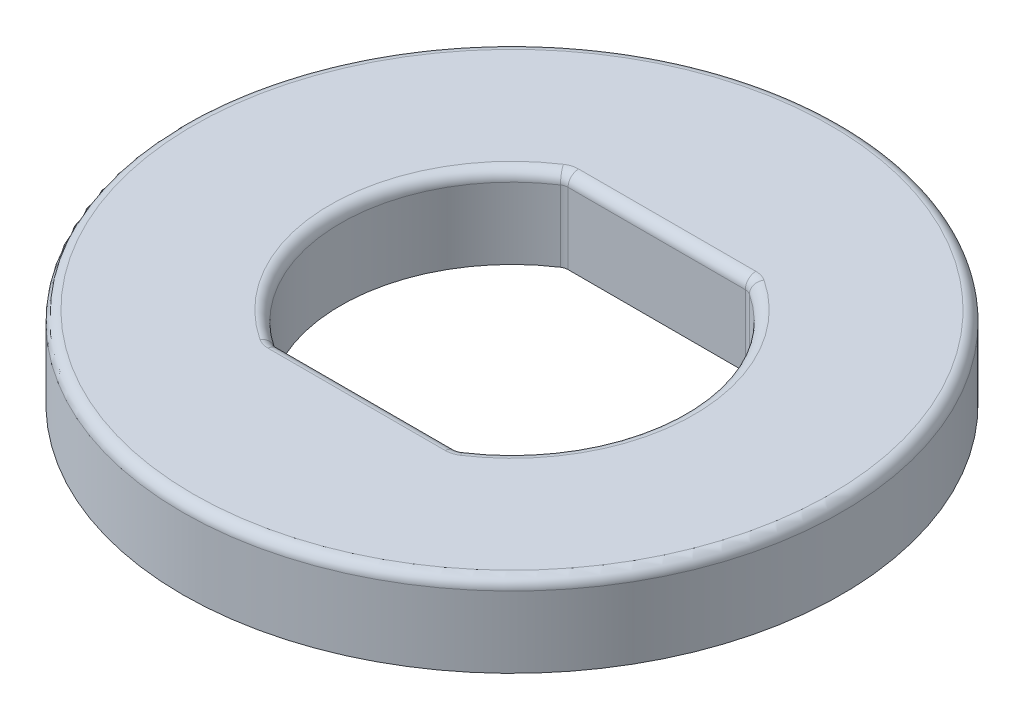
ISO-10303-21;
HEADER;
FILE_DESCRIPTION(('STEP AP214'),'2;1');
FILE_NAME('part.step','',(''),(''),'','','');
FILE_SCHEMA(('AUTOMOTIVE_DESIGN { 1 0 10303 214 1 1 1 1 }'));
ENDSEC;
DATA;
#1=APPLICATION_CONTEXT('core data for automotive mechanical design processes');
#2=APPLICATION_PROTOCOL_DEFINITION('international standard','automotive_design',2000,#1);
#3=PRODUCT_CONTEXT('',#1,'mechanical');
#4=PRODUCT('Part','Part','',(#3));
#5=PRODUCT_RELATED_PRODUCT_CATEGORY('part','',(#4));
#6=PRODUCT_DEFINITION_FORMATION('','',#4);
#7=PRODUCT_DEFINITION_CONTEXT('part definition',#1,'design');
#8=PRODUCT_DEFINITION('design','',#6,#7);
#9=PRODUCT_DEFINITION_SHAPE('','',#8);
#10=(LENGTH_UNIT() NAMED_UNIT(*) SI_UNIT(.MILLI.,.METRE.));
#11=(NAMED_UNIT(*) PLANE_ANGLE_UNIT() SI_UNIT($,.RADIAN.));
#12=(NAMED_UNIT(*) SI_UNIT($,.STERADIAN.) SOLID_ANGLE_UNIT());
#13=UNCERTAINTY_MEASURE_WITH_UNIT(LENGTH_MEASURE(1.E-05),#10,'distance_accuracy_value','');
#14=(GEOMETRIC_REPRESENTATION_CONTEXT(3) GLOBAL_UNCERTAINTY_ASSIGNED_CONTEXT((#13)) GLOBAL_UNIT_ASSIGNED_CONTEXT((#10,
#11,#12)) REPRESENTATION_CONTEXT('',''));
#15=CARTESIAN_POINT('',(0.,0.,0.));
#16=DIRECTION('',(0.,0.,1.));
#17=DIRECTION('',(1.,0.,0.));
#18=AXIS2_PLACEMENT_3D('',#15,#16,#17);
#19=CARTESIAN_POINT('',(0.,1.4732,0.));
#20=DIRECTION('',(0.,-1.,0.));
#21=DIRECTION('',(0.,0.,-1.));
#22=AXIS2_PLACEMENT_3D('',#19,#20,#21);
#23=CYLINDRICAL_SURFACE('',#22,6.16585);
#24=CARTESIAN_POINT('',(0.,1.0922,0.));
#25=DIRECTION('',(0.,1.,0.));
#26=DIRECTION('',(0.,0.,1.));
#27=AXIS2_PLACEMENT_3D('',#24,#25,#26);
#28=CIRCLE('',#27,6.16585);
#29=CARTESIAN_POINT('',(3.39978361741116,1.0922,5.14384851811196));
#30=VERTEX_POINT('',#29);
#31=CARTESIAN_POINT('',(3.39978361741116,1.0922,-5.14384851811196));
#32=VERTEX_POINT('',#31);
#33=EDGE_CURVE('E60',#30,#32,#28,.T.);
#34=ORIENTED_EDGE('',*,*,#33,.T.);
#35=DIRECTION('',(0.,-1.,0.));
#36=VECTOR('',#35,1.);
#37=CARTESIAN_POINT('',(3.39978361741116,1.4732,-5.14384851811196));
#38=LINE('',#37,#36);
#39=CARTESIAN_POINT('',(3.39978361741116,-1.4732,-5.14384851811196));
#40=VERTEX_POINT('',#39);
#41=EDGE_CURVE('E192',#32,#40,#38,.T.);
#42=ORIENTED_EDGE('',*,*,#41,.T.);
#43=CARTESIAN_POINT('',(0.,-1.4732,0.));
#44=DIRECTION('',(0.,1.,0.));
#45=DIRECTION('',(0.,0.,1.));
#46=AXIS2_PLACEMENT_3D('',#43,#44,#45);
#47=CIRCLE('',#46,6.16585);
#48=CARTESIAN_POINT('',(3.39978361741116,-1.4732,5.14384851811196));
#49=VERTEX_POINT('',#48);
#50=EDGE_CURVE('E157',#49,#40,#47,.T.);
#51=ORIENTED_EDGE('',*,*,#50,.F.);
#52=DIRECTION('',(0.,-1.,0.));
#53=VECTOR('',#52,1.);
#54=CARTESIAN_POINT('',(3.39978361741116,1.4732,5.14384851811196));
#55=LINE('',#54,#53);
#56=EDGE_CURVE('E65',#49,#30,#55,.F.);
#57=ORIENTED_EDGE('',*,*,#56,.T.);
#58=EDGE_LOOP('',(#34,#42,#51,#57));
#59=FACE_BOUND('',#58,.T.);
#60=ADVANCED_FACE('F43',(#59),#23,.F.);
#61=CARTESIAN_POINT('',(0.,1.4732,5.207));
#62=DIRECTION('',(0.,0.,-1.));
#63=DIRECTION('',(-1.,0.,0.));
#64=AXIS2_PLACEMENT_3D('',#61,#62,#63);
#65=PLANE('',#64);
#66=DIRECTION('',(1.,0.,0.));
#67=VECTOR('',#66,1.);
#68=CARTESIAN_POINT('',(0.,-1.4732,5.207));
#69=LINE('',#68,#67);
#70=CARTESIAN_POINT('',(-3.1897043001664,-1.4732,5.207));
#71=VERTEX_POINT('',#70);
#72=CARTESIAN_POINT('',(3.1897043001664,-1.4732,5.207));
#73=VERTEX_POINT('',#72);
#74=EDGE_CURVE('E159',#71,#73,#69,.T.);
#75=ORIENTED_EDGE('',*,*,#74,.F.);
#76=DIRECTION('',(0.,1.,0.));
#77=VECTOR('',#76,1.);
#78=CARTESIAN_POINT('',(-3.1897043001664,1.4732,5.207));
#79=LINE('',#78,#77);
#80=CARTESIAN_POINT('',(-3.1897043001664,1.0922,5.207));
#81=VERTEX_POINT('',#80);
#82=EDGE_CURVE('E196',#71,#81,#79,.T.);
#83=ORIENTED_EDGE('',*,*,#82,.T.);
#84=DIRECTION('',(1.,0.,0.));
#85=VECTOR('',#84,1.);
#86=CARTESIAN_POINT('',(0.,1.0922,5.207));
#87=LINE('',#86,#85);
#88=CARTESIAN_POINT('',(3.1897043001664,1.0922,5.207));
#89=VERTEX_POINT('',#88);
#90=EDGE_CURVE('E198',#81,#89,#87,.T.);
#91=ORIENTED_EDGE('',*,*,#90,.T.);
#92=DIRECTION('',(0.,1.,0.));
#93=VECTOR('',#92,1.);
#94=CARTESIAN_POINT('',(3.1897043001664,-1.4732,5.207));
#95=LINE('',#94,#93);
#96=EDGE_CURVE('E200',#89,#73,#95,.F.);
#97=ORIENTED_EDGE('',*,*,#96,.T.);
#98=EDGE_LOOP('',(#75,#83,#91,#97));
#99=FACE_BOUND('',#98,.T.);
#100=ADVANCED_FACE('F304',(#99),#65,.T.);
#101=CARTESIAN_POINT('',(0.,1.4732,0.));
#102=DIRECTION('',(0.,-1.,0.));
#103=DIRECTION('',(0.,0.,-1.));
#104=AXIS2_PLACEMENT_3D('',#101,#102,#103);
#105=CYLINDRICAL_SURFACE('',#104,6.16585);
#106=CARTESIAN_POINT('',(0.,1.0922,0.));
#107=DIRECTION('',(0.,1.,0.));
#108=DIRECTION('',(0.,0.,1.));
#109=AXIS2_PLACEMENT_3D('',#106,#107,#108);
#110=CIRCLE('',#109,6.16585);
#111=CARTESIAN_POINT('',(-3.39978361741117,1.0922,-5.14384851811196));
#112=VERTEX_POINT('',#111);
#113=CARTESIAN_POINT('',(-3.39978361741117,1.0922,5.14384851811196));
#114=VERTEX_POINT('',#113);
#115=EDGE_CURVE('E204',#112,#114,#110,.T.);
#116=ORIENTED_EDGE('',*,*,#115,.T.);
#117=DIRECTION('',(0.,-1.,0.));
#118=VECTOR('',#117,1.);
#119=CARTESIAN_POINT('',(-3.39978361741117,1.4732,5.14384851811196));
#120=LINE('',#119,#118);
#121=CARTESIAN_POINT('',(-3.39978361741117,-1.4732,5.14384851811196));
#122=VERTEX_POINT('',#121);
#123=EDGE_CURVE('E202',#114,#122,#120,.T.);
#124=ORIENTED_EDGE('',*,*,#123,.T.);
#125=CARTESIAN_POINT('',(0.,-1.4732,0.));
#126=DIRECTION('',(0.,1.,0.));
#127=DIRECTION('',(0.,0.,1.));
#128=AXIS2_PLACEMENT_3D('',#125,#126,#127);
#129=CIRCLE('',#128,6.16585);
#130=CARTESIAN_POINT('',(-3.39978361741117,-1.4732,-5.14384851811196));
#131=VERTEX_POINT('',#130);
#132=EDGE_CURVE('E239',#131,#122,#129,.T.);
#133=ORIENTED_EDGE('',*,*,#132,.F.);
#134=DIRECTION('',(0.,-1.,0.));
#135=VECTOR('',#134,1.);
#136=CARTESIAN_POINT('',(-3.39978361741117,1.4732,-5.14384851811196));
#137=LINE('',#136,#135);
#138=EDGE_CURVE('E206',#131,#112,#137,.F.);
#139=ORIENTED_EDGE('',*,*,#138,.T.);
#140=EDGE_LOOP('',(#116,#124,#133,#139));
#141=FACE_BOUND('',#140,.T.);
#142=ADVANCED_FACE('F276',(#141),#105,.F.);
#143=CARTESIAN_POINT('',(0.,1.4732,-5.207));
#144=DIRECTION('',(0.,0.,1.));
#145=DIRECTION('',(1.,0.,0.));
#146=AXIS2_PLACEMENT_3D('',#143,#144,#145);
#147=PLANE('',#146);
#148=DIRECTION('',(-1.,0.,0.));
#149=VECTOR('',#148,1.);
#150=CARTESIAN_POINT('',(0.,-1.4732,-5.207));
#151=LINE('',#150,#149);
#152=CARTESIAN_POINT('',(3.1897043001664,-1.4732,-5.207));
#153=VERTEX_POINT('',#152);
#154=CARTESIAN_POINT('',(-3.1897043001664,-1.4732,-5.207));
#155=VERTEX_POINT('',#154);
#156=EDGE_CURVE('E236',#153,#155,#151,.T.);
#157=ORIENTED_EDGE('',*,*,#156,.F.);
#158=DIRECTION('',(0.,1.,0.));
#159=VECTOR('',#158,1.);
#160=CARTESIAN_POINT('',(3.1897043001664,1.4732,-5.207));
#161=LINE('',#160,#159);
#162=CARTESIAN_POINT('',(3.1897043001664,1.0922,-5.207));
#163=VERTEX_POINT('',#162);
#164=EDGE_CURVE('E208',#153,#163,#161,.T.);
#165=ORIENTED_EDGE('',*,*,#164,.T.);
#166=DIRECTION('',(-1.,0.,0.));
#167=VECTOR('',#166,1.);
#168=CARTESIAN_POINT('',(0.,1.0922,-5.207));
#169=LINE('',#168,#167);
#170=CARTESIAN_POINT('',(-3.1897043001664,1.0922,-5.207));
#171=VERTEX_POINT('',#170);
#172=EDGE_CURVE('E210',#163,#171,#169,.T.);
#173=ORIENTED_EDGE('',*,*,#172,.T.);
#174=DIRECTION('',(0.,1.,0.));
#175=VECTOR('',#174,1.);
#176=CARTESIAN_POINT('',(-3.1897043001664,-1.4732,-5.207));
#177=LINE('',#176,#175);
#178=EDGE_CURVE('E213',#171,#155,#177,.F.);
#179=ORIENTED_EDGE('',*,*,#178,.T.);
#180=EDGE_LOOP('',(#157,#165,#173,#179));
#181=FACE_BOUND('',#180,.T.);
#182=ADVANCED_FACE('F268',(#181),#147,.T.);
#183=CARTESIAN_POINT('',(0.,1.4732,0.));
#184=DIRECTION('',(0.,-1.,0.));
#185=DIRECTION('',(0.,0.,-1.));
#186=AXIS2_PLACEMENT_3D('',#183,#184,#185);
#187=CYLINDRICAL_SURFACE('',#186,11.8618);
#188=CARTESIAN_POINT('',(0.,1.0922,0.));
#189=DIRECTION('',(0.,1.,0.));
#190=DIRECTION('',(0.,0.,1.));
#191=AXIS2_PLACEMENT_3D('',#188,#189,#190);
#192=CIRCLE('',#191,11.8618);
#193=CARTESIAN_POINT('',(0.,1.0922,11.8618));
#194=VERTEX_POINT('',#193);
#195=EDGE_CURVE('E215',#194,#194,#192,.F.);
#196=ORIENTED_EDGE('',*,*,#195,.T.);
#197=EDGE_LOOP('',(#196));
#198=FACE_BOUND('',#197,.T.);
#199=CARTESIAN_POINT('',(0.,-1.4732,0.));
#200=DIRECTION('',(0.,1.,0.));
#201=DIRECTION('',(0.,0.,1.));
#202=AXIS2_PLACEMENT_3D('',#199,#200,#201);
#203=CIRCLE('',#202,11.8618);
#204=CARTESIAN_POINT('',(0.,-1.4732,11.8618));
#205=VERTEX_POINT('',#204);
#206=EDGE_CURVE('E143',#205,#205,#203,.T.);
#207=ORIENTED_EDGE('',*,*,#206,.T.);
#208=EDGE_LOOP('',(#207));
#209=FACE_BOUND('',#208,.T.);
#210=ADVANCED_FACE('F325',(#198,#209),#187,.T.);
#211=CARTESIAN_POINT('',(0.,1.4732,0.));
#212=DIRECTION('',(0.,1.,0.));
#213=DIRECTION('',(0.,0.,1.));
#214=AXIS2_PLACEMENT_3D('',#211,#212,#213);
#215=PLANE('',#214);
#216=CARTESIAN_POINT('',(0.,1.4732,0.));
#217=DIRECTION('',(0.,1.,0.));
#218=DIRECTION('',(0.,0.,1.));
#219=AXIS2_PLACEMENT_3D('',#216,#217,#218);
#220=CIRCLE('',#219,11.4808);
#221=CARTESIAN_POINT('',(0.,1.4732,11.4808));
#222=VERTEX_POINT('',#221);
#223=EDGE_CURVE('E218',#222,#222,#220,.T.);
#224=ORIENTED_EDGE('',*,*,#223,.T.);
#225=EDGE_LOOP('',(#224));
#226=FACE_BOUND('',#225,.T.);
#227=CARTESIAN_POINT('',(-3.1897043001664,1.4732,4.826));
#228=DIRECTION('',(0.,1.,0.));
#229=DIRECTION('',(0.,0.,1.));
#230=AXIS2_PLACEMENT_3D('',#227,#228,#229);
#231=CIRCLE('',#230,0.762);
#232=CARTESIAN_POINT('',(-3.60986293465593,1.4732,5.46169703622393));
#233=VERTEX_POINT('',#232);
#234=CARTESIAN_POINT('',(-3.1897043001664,1.4732,5.588));
#235=VERTEX_POINT('',#234);
#236=EDGE_CURVE('E226',#233,#235,#231,.T.);
#237=ORIENTED_EDGE('',*,*,#236,.F.);
#238=CARTESIAN_POINT('',(0.,1.4732,0.));
#239=DIRECTION('',(0.,1.,0.));
#240=DIRECTION('',(0.,0.,1.));
#241=AXIS2_PLACEMENT_3D('',#238,#239,#240);
#242=CIRCLE('',#241,6.54685);
#243=CARTESIAN_POINT('',(-3.60986293465593,1.4732,-5.46169703622393));
#244=VERTEX_POINT('',#243);
#245=EDGE_CURVE('E221',#233,#244,#242,.F.);
#246=ORIENTED_EDGE('',*,*,#245,.T.);
#247=CARTESIAN_POINT('',(-3.1897043001664,1.4732,-4.826));
#248=DIRECTION('',(0.,1.,0.));
#249=DIRECTION('',(0.,0.,1.));
#250=AXIS2_PLACEMENT_3D('',#247,#248,#249);
#251=CIRCLE('',#250,0.762);
#252=CARTESIAN_POINT('',(-3.1897043001664,1.4732,-5.588));
#253=VERTEX_POINT('',#252);
#254=EDGE_CURVE('E223',#253,#244,#251,.T.);
#255=ORIENTED_EDGE('',*,*,#254,.F.);
#256=DIRECTION('',(-1.,0.,0.));
#257=VECTOR('',#256,1.);
#258=CARTESIAN_POINT('',(0.,1.4732,-5.588));
#259=LINE('',#258,#257);
#260=CARTESIAN_POINT('',(3.1897043001664,1.4732,-5.588));
#261=VERTEX_POINT('',#260);
#262=EDGE_CURVE('E228',#253,#261,#259,.F.);
#263=ORIENTED_EDGE('',*,*,#262,.T.);
#264=CARTESIAN_POINT('',(3.1897043001664,1.4732,-4.826));
#265=DIRECTION('',(0.,1.,0.));
#266=DIRECTION('',(0.,0.,1.));
#267=AXIS2_PLACEMENT_3D('',#264,#265,#266);
#268=CIRCLE('',#267,0.762);
#269=CARTESIAN_POINT('',(3.60986293465593,1.4732,-5.46169703622393));
#270=VERTEX_POINT('',#269);
#271=EDGE_CURVE('E153',#270,#261,#268,.T.);
#272=ORIENTED_EDGE('',*,*,#271,.F.);
#273=CARTESIAN_POINT('',(0.,1.4732,0.));
#274=DIRECTION('',(0.,1.,0.));
#275=DIRECTION('',(0.,0.,1.));
#276=AXIS2_PLACEMENT_3D('',#273,#274,#275);
#277=CIRCLE('',#276,6.54685);
#278=CARTESIAN_POINT('',(3.60986293465593,1.4732,5.46169703622393));
#279=VERTEX_POINT('',#278);
#280=EDGE_CURVE('E138',#270,#279,#277,.F.);
#281=ORIENTED_EDGE('',*,*,#280,.T.);
#282=CARTESIAN_POINT('',(3.1897043001664,1.4732,4.826));
#283=DIRECTION('',(0.,1.,0.));
#284=DIRECTION('',(0.,0.,1.));
#285=AXIS2_PLACEMENT_3D('',#282,#283,#284);
#286=CIRCLE('',#285,0.762);
#287=CARTESIAN_POINT('',(3.1897043001664,1.4732,5.588));
#288=VERTEX_POINT('',#287);
#289=EDGE_CURVE('E132',#288,#279,#286,.T.);
#290=ORIENTED_EDGE('',*,*,#289,.F.);
#291=DIRECTION('',(1.,0.,0.));
#292=VECTOR('',#291,1.);
#293=CARTESIAN_POINT('',(0.,1.4732,5.588));
#294=LINE('',#293,#292);
#295=EDGE_CURVE('E135',#288,#235,#294,.F.);
#296=ORIENTED_EDGE('',*,*,#295,.T.);
#297=EDGE_LOOP('',(#237,#246,#255,#263,#272,#281,#290,#296));
#298=FACE_BOUND('',#297,.T.);
#299=ADVANCED_FACE('F134',(#226,#298),#215,.T.);
#300=CARTESIAN_POINT('',(0.,-1.4732,0.));
#301=DIRECTION('',(0.,1.,0.));
#302=DIRECTION('',(0.,0.,1.));
#303=AXIS2_PLACEMENT_3D('',#300,#301,#302);
#304=PLANE('',#303);
#305=ORIENTED_EDGE('',*,*,#74,.T.);
#306=CARTESIAN_POINT('',(3.1897043001664,-1.4732,4.826));
#307=DIRECTION('',(0.,1.,0.));
#308=DIRECTION('',(0.,0.,1.));
#309=AXIS2_PLACEMENT_3D('',#306,#307,#308);
#310=CIRCLE('',#309,0.381);
#311=EDGE_CURVE('E52',#73,#49,#310,.T.);
#312=ORIENTED_EDGE('',*,*,#311,.T.);
#313=ORIENTED_EDGE('',*,*,#50,.T.);
#314=CARTESIAN_POINT('',(3.1897043001664,-1.4732,-4.826));
#315=DIRECTION('',(0.,1.,0.));
#316=DIRECTION('',(0.,0.,1.));
#317=AXIS2_PLACEMENT_3D('',#314,#315,#316);
#318=CIRCLE('',#317,0.381);
#319=EDGE_CURVE('E190',#40,#153,#318,.T.);
#320=ORIENTED_EDGE('',*,*,#319,.T.);
#321=ORIENTED_EDGE('',*,*,#156,.T.);
#322=CARTESIAN_POINT('',(-3.1897043001664,-1.4732,-4.826));
#323=DIRECTION('',(0.,1.,0.));
#324=DIRECTION('',(0.,0.,1.));
#325=AXIS2_PLACEMENT_3D('',#322,#323,#324);
#326=CIRCLE('',#325,0.381);
#327=EDGE_CURVE('E11',#155,#131,#326,.T.);
#328=ORIENTED_EDGE('',*,*,#327,.T.);
#329=ORIENTED_EDGE('',*,*,#132,.T.);
#330=CARTESIAN_POINT('',(-3.1897043001664,-1.4732,4.826));
#331=DIRECTION('',(0.,1.,0.));
#332=DIRECTION('',(0.,0.,1.));
#333=AXIS2_PLACEMENT_3D('',#330,#331,#332);
#334=CIRCLE('',#333,0.381);
#335=EDGE_CURVE('E188',#122,#71,#334,.T.);
#336=ORIENTED_EDGE('',*,*,#335,.T.);
#337=EDGE_LOOP('',(#305,#312,#313,#320,#321,#328,#329,#336));
#338=FACE_BOUND('',#337,.T.);
#339=ORIENTED_EDGE('',*,*,#206,.F.);
#340=EDGE_LOOP('',(#339));
#341=FACE_BOUND('',#340,.T.);
#342=ADVANCED_FACE('F246',(#338,#341),#304,.F.);
#343=CARTESIAN_POINT('',(0.,1.0922,0.));
#344=DIRECTION('',(0.,1.,0.));
#345=DIRECTION('',(0.,0.,1.));
#346=AXIS2_PLACEMENT_3D('',#343,#344,#345);
#347=TOROIDAL_SURFACE('',#346,11.4808,0.381);
#348=ORIENTED_EDGE('',*,*,#195,.F.);
#349=EDGE_LOOP('',(#348));
#350=FACE_BOUND('',#349,.T.);
#351=ORIENTED_EDGE('',*,*,#223,.F.);
#352=EDGE_LOOP('',(#351));
#353=FACE_BOUND('',#352,.T.);
#354=ADVANCED_FACE('F312',(#350,#353),#347,.T.);
#355=CARTESIAN_POINT('',(3.1897043001664,1.4732,4.826));
#356=DIRECTION('',(0.,-1.,0.));
#357=DIRECTION('',(0.,0.,-1.));
#358=AXIS2_PLACEMENT_3D('',#355,#356,#357);
#359=CYLINDRICAL_SURFACE('',#358,0.381);
#360=ORIENTED_EDGE('',*,*,#311,.F.);
#361=ORIENTED_EDGE('',*,*,#96,.F.);
#362=CARTESIAN_POINT('',(3.1897043001664,1.0922,4.826));
#363=DIRECTION('',(0.,1.,0.));
#364=DIRECTION('',(0.,0.,1.));
#365=AXIS2_PLACEMENT_3D('',#362,#363,#364);
#366=CIRCLE('',#365,0.381);
#367=EDGE_CURVE('E156',#30,#89,#366,.F.);
#368=ORIENTED_EDGE('',*,*,#367,.F.);
#369=ORIENTED_EDGE('',*,*,#56,.F.);
#370=EDGE_LOOP('',(#360,#361,#368,#369));
#371=FACE_BOUND('',#370,.T.);
#372=ADVANCED_FACE('F45',(#371),#359,.F.);
#373=CARTESIAN_POINT('',(-3.1897043001664,1.4732,4.826));
#374=DIRECTION('',(0.,-1.,0.));
#375=DIRECTION('',(0.,0.,-1.));
#376=AXIS2_PLACEMENT_3D('',#373,#374,#375);
#377=CYLINDRICAL_SURFACE('',#376,0.381);
#378=ORIENTED_EDGE('',*,*,#335,.F.);
#379=ORIENTED_EDGE('',*,*,#123,.F.);
#380=CARTESIAN_POINT('',(-3.1897043001664,1.0922,4.826));
#381=DIRECTION('',(0.,1.,0.));
#382=DIRECTION('',(0.,0.,1.));
#383=AXIS2_PLACEMENT_3D('',#380,#381,#382);
#384=CIRCLE('',#383,0.381);
#385=EDGE_CURVE('E161',#81,#114,#384,.F.);
#386=ORIENTED_EDGE('',*,*,#385,.F.);
#387=ORIENTED_EDGE('',*,*,#82,.F.);
#388=EDGE_LOOP('',(#378,#379,#386,#387));
#389=FACE_BOUND('',#388,.T.);
#390=ADVANCED_FACE('F281',(#389),#377,.F.);
#391=CARTESIAN_POINT('',(0.,1.0922,5.588));
#392=DIRECTION('',(1.,0.,0.));
#393=DIRECTION('',(0.,0.,-1.));
#394=AXIS2_PLACEMENT_3D('',#391,#392,#393);
#395=CYLINDRICAL_SURFACE('',#394,0.381);
#396=CARTESIAN_POINT('',(-3.1897043001664,1.0922,5.588));
#397=DIRECTION('',(-1.,0.,0.));
#398=DIRECTION('',(0.,0.,1.));
#399=AXIS2_PLACEMENT_3D('',#396,#397,#398);
#400=CIRCLE('',#399,0.381);
#401=EDGE_CURVE('E151',#235,#81,#400,.T.);
#402=ORIENTED_EDGE('',*,*,#401,.F.);
#403=ORIENTED_EDGE('',*,*,#295,.F.);
#404=CARTESIAN_POINT('',(3.1897043001664,1.0922,5.588));
#405=DIRECTION('',(1.,0.,0.));
#406=DIRECTION('',(0.,0.,-1.));
#407=AXIS2_PLACEMENT_3D('',#404,#405,#406);
#408=CIRCLE('',#407,0.381);
#409=EDGE_CURVE('E47',#89,#288,#408,.T.);
#410=ORIENTED_EDGE('',*,*,#409,.F.);
#411=ORIENTED_EDGE('',*,*,#90,.F.);
#412=EDGE_LOOP('',(#402,#403,#410,#411));
#413=FACE_BOUND('',#412,.T.);
#414=ADVANCED_FACE('F147',(#413),#395,.T.);
#415=CARTESIAN_POINT('',(3.1897043001664,1.0922,4.826));
#416=DIRECTION('',(0.,1.,0.));
#417=DIRECTION('',(0.,0.,1.));
#418=AXIS2_PLACEMENT_3D('',#415,#416,#417);
#419=TOROIDAL_SURFACE('',#418,0.762,0.381);
#420=ORIENTED_EDGE('',*,*,#409,.T.);
#421=ORIENTED_EDGE('',*,*,#289,.T.);
#422=CARTESIAN_POINT('',(3.60986293465593,1.0922,5.46169703622393));
#423=DIRECTION('',(-0.834248079034028,0.,0.551389284107004));
#424=DIRECTION('',(0.551389284107004,0.,0.834248079034028));
#425=AXIS2_PLACEMENT_3D('',#422,#423,#424);
#426=CIRCLE('',#425,0.381);
#427=EDGE_CURVE('E166',#30,#279,#426,.F.);
#428=ORIENTED_EDGE('',*,*,#427,.F.);
#429=ORIENTED_EDGE('',*,*,#367,.T.);
#430=EDGE_LOOP('',(#420,#421,#428,#429));
#431=FACE_BOUND('',#430,.T.);
#432=ADVANCED_FACE('F155',(#431),#419,.T.);
#433=CARTESIAN_POINT('',(-3.1897043001664,1.0922,4.826));
#434=DIRECTION('',(0.,1.,0.));
#435=DIRECTION('',(0.,0.,1.));
#436=AXIS2_PLACEMENT_3D('',#433,#434,#435);
#437=TOROIDAL_SURFACE('',#436,0.762,0.381);
#438=ORIENTED_EDGE('',*,*,#401,.T.);
#439=ORIENTED_EDGE('',*,*,#385,.T.);
#440=CARTESIAN_POINT('',(-3.60986293465593,1.0922,5.46169703622393));
#441=DIRECTION('',(0.834248079034028,0.,0.551389284107004));
#442=DIRECTION('',(0.551389284107004,0.,-0.834248079034028));
#443=AXIS2_PLACEMENT_3D('',#440,#441,#442);
#444=CIRCLE('',#443,0.381);
#445=EDGE_CURVE('E168',#233,#114,#444,.F.);
#446=ORIENTED_EDGE('',*,*,#445,.F.);
#447=ORIENTED_EDGE('',*,*,#236,.T.);
#448=EDGE_LOOP('',(#438,#439,#446,#447));
#449=FACE_BOUND('',#448,.T.);
#450=ADVANCED_FACE('F284',(#449),#437,.T.);
#451=CARTESIAN_POINT('',(0.,1.0922,0.));
#452=DIRECTION('',(0.,1.,0.));
#453=DIRECTION('',(0.,0.,1.));
#454=AXIS2_PLACEMENT_3D('',#451,#452,#453);
#455=TOROIDAL_SURFACE('',#454,6.54685,0.381);
#456=ORIENTED_EDGE('',*,*,#427,.T.);
#457=ORIENTED_EDGE('',*,*,#280,.F.);
#458=CARTESIAN_POINT('',(3.60986293465593,1.0922,-5.46169703622393));
#459=DIRECTION('',(-0.834248079034028,0.,-0.551389284107004));
#460=DIRECTION('',(-0.551389284107004,0.,0.834248079034028));
#461=AXIS2_PLACEMENT_3D('',#458,#459,#460);
#462=CIRCLE('',#461,0.381);
#463=EDGE_CURVE('E171',#32,#270,#462,.T.);
#464=ORIENTED_EDGE('',*,*,#463,.F.);
#465=ORIENTED_EDGE('',*,*,#33,.F.);
#466=EDGE_LOOP('',(#456,#457,#464,#465));
#467=FACE_BOUND('',#466,.T.);
#468=ADVANCED_FACE('F255',(#467),#455,.T.);
#469=CARTESIAN_POINT('',(3.1897043001664,1.4732,-4.826));
#470=DIRECTION('',(0.,-1.,0.));
#471=DIRECTION('',(0.,0.,-1.));
#472=AXIS2_PLACEMENT_3D('',#469,#470,#471);
#473=CYLINDRICAL_SURFACE('',#472,0.381);
#474=ORIENTED_EDGE('',*,*,#319,.F.);
#475=ORIENTED_EDGE('',*,*,#41,.F.);
#476=CARTESIAN_POINT('',(3.1897043001664,1.0922,-4.826));
#477=DIRECTION('',(0.,1.,0.));
#478=DIRECTION('',(0.,0.,1.));
#479=AXIS2_PLACEMENT_3D('',#476,#477,#478);
#480=CIRCLE('',#479,0.381);
#481=EDGE_CURVE('E174',#163,#32,#480,.F.);
#482=ORIENTED_EDGE('',*,*,#481,.F.);
#483=ORIENTED_EDGE('',*,*,#164,.F.);
#484=EDGE_LOOP('',(#474,#475,#482,#483));
#485=FACE_BOUND('',#484,.T.);
#486=ADVANCED_FACE('F264',(#485),#473,.F.);
#487=CARTESIAN_POINT('',(-3.1897043001664,1.4732,-4.826));
#488=DIRECTION('',(0.,-1.,0.));
#489=DIRECTION('',(0.,0.,-1.));
#490=AXIS2_PLACEMENT_3D('',#487,#488,#489);
#491=CYLINDRICAL_SURFACE('',#490,0.381);
#492=ORIENTED_EDGE('',*,*,#327,.F.);
#493=ORIENTED_EDGE('',*,*,#178,.F.);
#494=CARTESIAN_POINT('',(-3.1897043001664,1.0922,-4.826));
#495=DIRECTION('',(0.,1.,0.));
#496=DIRECTION('',(0.,0.,1.));
#497=AXIS2_PLACEMENT_3D('',#494,#495,#496);
#498=CIRCLE('',#497,0.381);
#499=EDGE_CURVE('E177',#112,#171,#498,.F.);
#500=ORIENTED_EDGE('',*,*,#499,.F.);
#501=ORIENTED_EDGE('',*,*,#138,.F.);
#502=EDGE_LOOP('',(#492,#493,#500,#501));
#503=FACE_BOUND('',#502,.T.);
#504=ADVANCED_FACE('F272',(#503),#491,.F.);
#505=CARTESIAN_POINT('',(0.,1.0922,0.));
#506=DIRECTION('',(0.,1.,0.));
#507=DIRECTION('',(0.,0.,1.));
#508=AXIS2_PLACEMENT_3D('',#505,#506,#507);
#509=TOROIDAL_SURFACE('',#508,6.54685,0.381);
#510=ORIENTED_EDGE('',*,*,#445,.T.);
#511=ORIENTED_EDGE('',*,*,#115,.F.);
#512=CARTESIAN_POINT('',(-3.60986293465593,1.0922,-5.46169703622393));
#513=DIRECTION('',(0.834248079034028,0.,-0.551389284107004));
#514=DIRECTION('',(-0.551389284107004,0.,-0.834248079034028));
#515=AXIS2_PLACEMENT_3D('',#512,#513,#514);
#516=CIRCLE('',#515,0.381);
#517=EDGE_CURVE('E180',#244,#112,#516,.T.);
#518=ORIENTED_EDGE('',*,*,#517,.F.);
#519=ORIENTED_EDGE('',*,*,#245,.F.);
#520=EDGE_LOOP('',(#510,#511,#518,#519));
#521=FACE_BOUND('',#520,.T.);
#522=ADVANCED_FACE('F287',(#521),#509,.T.);
#523=CARTESIAN_POINT('',(3.1897043001664,1.0922,-4.826));
#524=DIRECTION('',(0.,1.,0.));
#525=DIRECTION('',(0.,0.,1.));
#526=AXIS2_PLACEMENT_3D('',#523,#524,#525);
#527=TOROIDAL_SURFACE('',#526,0.762,0.381);
#528=ORIENTED_EDGE('',*,*,#463,.T.);
#529=ORIENTED_EDGE('',*,*,#271,.T.);
#530=CARTESIAN_POINT('',(3.1897043001664,1.0922,-5.588));
#531=DIRECTION('',(1.,0.,0.));
#532=DIRECTION('',(0.,0.,-1.));
#533=AXIS2_PLACEMENT_3D('',#530,#531,#532);
#534=CIRCLE('',#533,0.381);
#535=EDGE_CURVE('E183',#163,#261,#534,.F.);
#536=ORIENTED_EDGE('',*,*,#535,.F.);
#537=ORIENTED_EDGE('',*,*,#481,.T.);
#538=EDGE_LOOP('',(#528,#529,#536,#537));
#539=FACE_BOUND('',#538,.T.);
#540=ADVANCED_FACE('F259',(#539),#527,.T.);
#541=CARTESIAN_POINT('',(-3.1897043001664,1.0922,-4.826));
#542=DIRECTION('',(0.,1.,0.));
#543=DIRECTION('',(0.,0.,1.));
#544=AXIS2_PLACEMENT_3D('',#541,#542,#543);
#545=TOROIDAL_SURFACE('',#544,0.762,0.381);
#546=ORIENTED_EDGE('',*,*,#517,.T.);
#547=ORIENTED_EDGE('',*,*,#499,.T.);
#548=CARTESIAN_POINT('',(-3.1897043001664,1.0922,-5.588));
#549=DIRECTION('',(-1.,0.,0.));
#550=DIRECTION('',(0.,0.,1.));
#551=AXIS2_PLACEMENT_3D('',#548,#549,#550);
#552=CIRCLE('',#551,0.381);
#553=EDGE_CURVE('E185',#253,#171,#552,.F.);
#554=ORIENTED_EDGE('',*,*,#553,.F.);
#555=ORIENTED_EDGE('',*,*,#254,.T.);
#556=EDGE_LOOP('',(#546,#547,#554,#555));
#557=FACE_BOUND('',#556,.T.);
#558=ADVANCED_FACE('F294',(#557),#545,.T.);
#559=CARTESIAN_POINT('',(0.,1.0922,-5.588));
#560=DIRECTION('',(-1.,0.,0.));
#561=DIRECTION('',(0.,0.,1.));
#562=AXIS2_PLACEMENT_3D('',#559,#560,#561);
#563=CYLINDRICAL_SURFACE('',#562,0.381);
#564=ORIENTED_EDGE('',*,*,#535,.T.);
#565=ORIENTED_EDGE('',*,*,#262,.F.);
#566=ORIENTED_EDGE('',*,*,#553,.T.);
#567=ORIENTED_EDGE('',*,*,#172,.F.);
#568=EDGE_LOOP('',(#564,#565,#566,#567));
#569=FACE_BOUND('',#568,.T.);
#570=ADVANCED_FACE('F293',(#569),#563,.T.);
#571=CLOSED_SHELL('',(#60,#100,#142,#182,#210,#299,#342,#354,#372,#390,#414,#432,#450,#468,#486,
#504,#522,#540,#558,#570));
#572=MANIFOLD_SOLID_BREP('B2',#571);
#573=ADVANCED_BREP_SHAPE_REPRESENTATION('',(#18,#572),#14);
#574=SHAPE_DEFINITION_REPRESENTATION(#9,#573);
ENDSEC;
END-ISO-10303-21;
